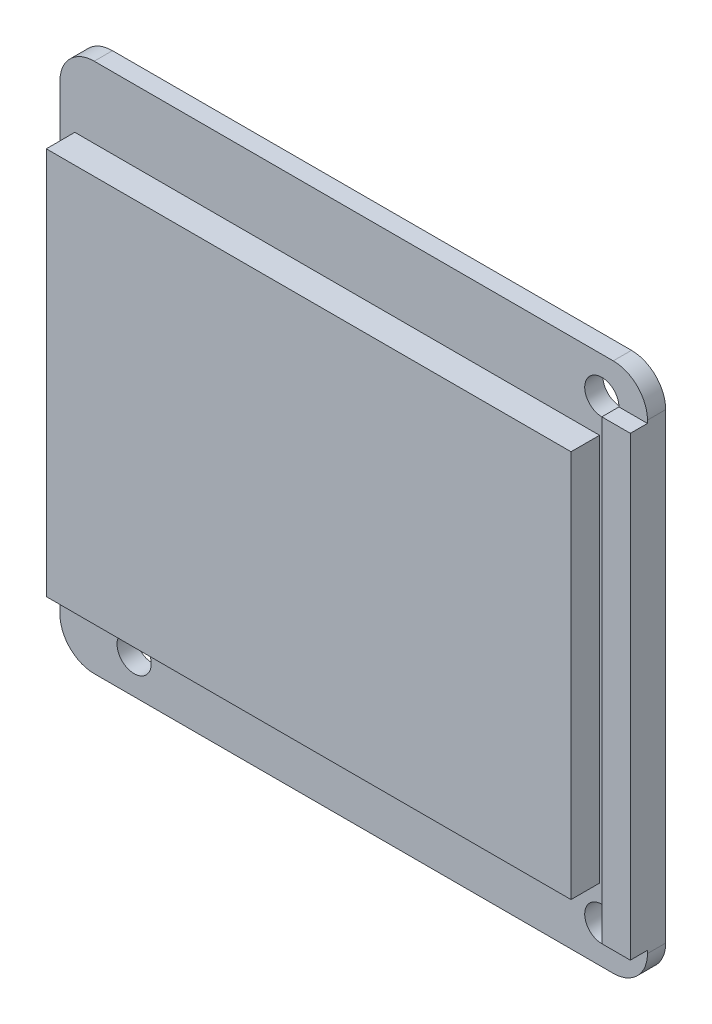
ISO-10303-21;
HEADER;
FILE_DESCRIPTION(('STEP AP214'),'2;1');
FILE_NAME('part.step','',(''),(''),'','','');
FILE_SCHEMA(('AUTOMOTIVE_DESIGN { 1 0 10303 214 1 1 1 1 }'));
ENDSEC;
DATA;
#1=APPLICATION_CONTEXT('core data for automotive mechanical design processes');
#2=APPLICATION_PROTOCOL_DEFINITION('international standard','automotive_design',2000,#1);
#3=PRODUCT_CONTEXT('',#1,'mechanical');
#4=PRODUCT('Part','Part','',(#3));
#5=PRODUCT_RELATED_PRODUCT_CATEGORY('part','',(#4));
#6=PRODUCT_DEFINITION_FORMATION('','',#4);
#7=PRODUCT_DEFINITION_CONTEXT('part definition',#1,'design');
#8=PRODUCT_DEFINITION('design','',#6,#7);
#9=PRODUCT_DEFINITION_SHAPE('','',#8);
#10=(LENGTH_UNIT() NAMED_UNIT(*) SI_UNIT(.MILLI.,.METRE.));
#11=(NAMED_UNIT(*) PLANE_ANGLE_UNIT() SI_UNIT($,.RADIAN.));
#12=(NAMED_UNIT(*) SI_UNIT($,.STERADIAN.) SOLID_ANGLE_UNIT());
#13=UNCERTAINTY_MEASURE_WITH_UNIT(LENGTH_MEASURE(1.E-05),#10,'distance_accuracy_value','');
#14=(GEOMETRIC_REPRESENTATION_CONTEXT(3) GLOBAL_UNCERTAINTY_ASSIGNED_CONTEXT((#13)) GLOBAL_UNIT_ASSIGNED_CONTEXT((#10,
#11,#12)) REPRESENTATION_CONTEXT('',''));
#15=CARTESIAN_POINT('',(0.,0.,0.));
#16=DIRECTION('',(0.,0.,1.));
#17=DIRECTION('',(1.,0.,0.));
#18=AXIS2_PLACEMENT_3D('',#15,#16,#17);
#19=CARTESIAN_POINT('',(0.,0.,1.6));
#20=DIRECTION('',(0.,0.,-1.));
#21=DIRECTION('',(-1.,0.,0.));
#22=AXIS2_PLACEMENT_3D('',#19,#20,#21);
#23=PLANE('',#22);
#24=CARTESIAN_POINT('',(6.5,3.25,1.6));
#25=DIRECTION('',(0.,0.,1.));
#26=DIRECTION('',(1.,0.,0.));
#27=AXIS2_PLACEMENT_3D('',#24,#25,#26);
#28=CIRCLE('',#27,1.5);
#29=CARTESIAN_POINT('',(8.,3.25,1.6));
#30=VERTEX_POINT('',#29);
#31=EDGE_CURVE('E504',#30,#30,#28,.T.);
#32=ORIENTED_EDGE('',*,*,#31,.F.);
#33=EDGE_LOOP('',(#32));
#34=FACE_BOUND('',#33,.T.);
#35=DIRECTION('',(0.,-1.,0.));
#36=VECTOR('',#35,1.);
#37=CARTESIAN_POINT('',(1.3,40.25,1.6));
#38=LINE('',#37,#36);
#39=CARTESIAN_POINT('',(1.3,40.25,1.6));
#40=VERTEX_POINT('',#39);
#41=CARTESIAN_POINT('',(1.3,6.25,1.6));
#42=VERTEX_POINT('',#41);
#43=EDGE_CURVE('E174',#40,#42,#38,.T.);
#44=ORIENTED_EDGE('',*,*,#43,.F.);
#45=DIRECTION('',(-1.,0.,0.));
#46=VECTOR('',#45,1.);
#47=CARTESIAN_POINT('',(1.3,40.25,1.6));
#48=LINE('',#47,#46);
#49=CARTESIAN_POINT('',(47.3,40.25,1.6));
#50=VERTEX_POINT('',#49);
#51=EDGE_CURVE('E187',#50,#40,#48,.T.);
#52=ORIENTED_EDGE('',*,*,#51,.F.);
#53=DIRECTION('',(0.,1.,0.));
#54=VECTOR('',#53,1.);
#55=CARTESIAN_POINT('',(47.3,40.25,1.6));
#56=LINE('',#55,#54);
#57=CARTESIAN_POINT('',(47.3,6.25,1.6));
#58=VERTEX_POINT('',#57);
#59=EDGE_CURVE('E196',#58,#50,#56,.T.);
#60=ORIENTED_EDGE('',*,*,#59,.F.);
#61=DIRECTION('',(1.,0.,0.));
#62=VECTOR('',#61,1.);
#63=CARTESIAN_POINT('',(1.3,6.25,1.6));
#64=LINE('',#63,#62);
#65=EDGE_CURVE('E177',#42,#58,#64,.T.);
#66=ORIENTED_EDGE('',*,*,#65,.F.);
#67=EDGE_LOOP('',(#44,#52,#60,#66));
#68=FACE_BOUND('',#67,.T.);
#69=DIRECTION('',(0.,1.,0.));
#70=VECTOR('',#69,1.);
#71=CARTESIAN_POINT('',(51.5,0.,1.6));
#72=LINE('',#71,#70);
#73=CARTESIAN_POINT('',(51.5,43.25,1.6));
#74=VERTEX_POINT('',#73);
#75=CARTESIAN_POINT('',(51.5,43.5,1.6));
#76=VERTEX_POINT('',#75);
#77=EDGE_CURVE('E172',#74,#76,#72,.T.);
#78=ORIENTED_EDGE('',*,*,#77,.T.);
#79=CARTESIAN_POINT('',(48.5,43.5,1.6));
#80=DIRECTION('',(0.,0.,-1.));
#81=DIRECTION('',(-1.,0.,0.));
#82=AXIS2_PLACEMENT_3D('',#79,#80,#81);
#83=CIRCLE('',#82,3.);
#84=CARTESIAN_POINT('',(48.5,46.5,1.6));
#85=VERTEX_POINT('',#84);
#86=EDGE_CURVE('E254',#76,#85,#83,.F.);
#87=ORIENTED_EDGE('',*,*,#86,.T.);
#88=DIRECTION('',(-1.,0.,0.));
#89=VECTOR('',#88,1.);
#90=CARTESIAN_POINT('',(0.,46.5,1.6));
#91=LINE('',#90,#89);
#92=CARTESIAN_POINT('',(3.,46.5,1.6));
#93=VERTEX_POINT('',#92);
#94=EDGE_CURVE('E220',#85,#93,#91,.T.);
#95=ORIENTED_EDGE('',*,*,#94,.T.);
#96=CARTESIAN_POINT('',(3.,43.5,1.6));
#97=DIRECTION('',(0.,0.,-1.));
#98=DIRECTION('',(-1.,0.,0.));
#99=AXIS2_PLACEMENT_3D('',#96,#97,#98);
#100=CIRCLE('',#99,3.);
#101=CARTESIAN_POINT('',(0.,43.5,1.6));
#102=VERTEX_POINT('',#101);
#103=EDGE_CURVE('E252',#93,#102,#100,.F.);
#104=ORIENTED_EDGE('',*,*,#103,.T.);
#105=DIRECTION('',(0.,-1.,0.));
#106=VECTOR('',#105,1.);
#107=CARTESIAN_POINT('',(0.,0.,1.6));
#108=LINE('',#107,#106);
#109=CARTESIAN_POINT('',(0.,3.,1.6));
#110=VERTEX_POINT('',#109);
#111=EDGE_CURVE('E213',#102,#110,#108,.T.);
#112=ORIENTED_EDGE('',*,*,#111,.T.);
#113=CARTESIAN_POINT('',(3.,3.,1.6));
#114=DIRECTION('',(0.,0.,-1.));
#115=DIRECTION('',(-1.,0.,0.));
#116=AXIS2_PLACEMENT_3D('',#113,#114,#115);
#117=CIRCLE('',#116,3.);
#118=CARTESIAN_POINT('',(3.,0.,1.6));
#119=VERTEX_POINT('',#118);
#120=EDGE_CURVE('E54',#110,#119,#117,.F.);
#121=ORIENTED_EDGE('',*,*,#120,.T.);
#122=DIRECTION('',(1.,0.,0.));
#123=VECTOR('',#122,1.);
#124=CARTESIAN_POINT('',(0.,0.,1.6));
#125=LINE('',#124,#123);
#126=CARTESIAN_POINT('',(48.5,0.,1.6));
#127=VERTEX_POINT('',#126);
#128=EDGE_CURVE('E215',#119,#127,#125,.T.);
#129=ORIENTED_EDGE('',*,*,#128,.T.);
#130=CARTESIAN_POINT('',(48.5,3.,1.6));
#131=DIRECTION('',(0.,0.,-1.));
#132=DIRECTION('',(-1.,0.,0.));
#133=AXIS2_PLACEMENT_3D('',#130,#131,#132);
#134=CIRCLE('',#133,3.);
#135=CARTESIAN_POINT('',(51.5,3.,1.6));
#136=VERTEX_POINT('',#135);
#137=EDGE_CURVE('E249',#127,#136,#134,.F.);
#138=ORIENTED_EDGE('',*,*,#137,.T.);
#139=CARTESIAN_POINT('',(51.5,3.25,1.6));
#140=VERTEX_POINT('',#139);
#141=EDGE_CURVE('E218',#136,#140,#72,.T.);
#142=ORIENTED_EDGE('',*,*,#141,.T.);
#143=DIRECTION('',(1.,0.,0.));
#144=VECTOR('',#143,1.);
#145=CARTESIAN_POINT('',(51.5,3.25,1.6));
#146=LINE('',#145,#144);
#147=CARTESIAN_POINT('',(49.,3.25,1.6));
#148=VERTEX_POINT('',#147);
#149=EDGE_CURVE('E167',#148,#140,#146,.T.);
#150=ORIENTED_EDGE('',*,*,#149,.F.);
#151=CARTESIAN_POINT('',(47.5,3.25,1.6));
#152=DIRECTION('',(0.,0.,1.));
#153=DIRECTION('',(1.,0.,0.));
#154=AXIS2_PLACEMENT_3D('',#151,#152,#153);
#155=CIRCLE('',#154,1.5);
#156=EDGE_CURVE('E501',#148,#148,#155,.T.);
#157=ORIENTED_EDGE('',*,*,#156,.F.);
#158=DIRECTION('',(0.,-1.,0.));
#159=VECTOR('',#158,1.);
#160=CARTESIAN_POINT('',(49.,43.25,1.6));
#161=LINE('',#160,#159);
#162=CARTESIAN_POINT('',(49.,43.25,1.6));
#163=VERTEX_POINT('',#162);
#164=EDGE_CURVE('E518',#163,#148,#161,.T.);
#165=ORIENTED_EDGE('',*,*,#164,.F.);
#166=CARTESIAN_POINT('',(47.5,43.25,1.6));
#167=DIRECTION('',(0.,0.,1.));
#168=DIRECTION('',(1.,0.,0.));
#169=AXIS2_PLACEMENT_3D('',#166,#167,#168);
#170=CIRCLE('',#169,1.5);
#171=EDGE_CURVE('E497',#163,#163,#170,.T.);
#172=ORIENTED_EDGE('',*,*,#171,.F.);
#173=DIRECTION('',(-1.,0.,0.));
#174=VECTOR('',#173,1.);
#175=CARTESIAN_POINT('',(51.5,43.25,1.6));
#176=LINE('',#175,#174);
#177=EDGE_CURVE('E512',#74,#163,#176,.T.);
#178=ORIENTED_EDGE('',*,*,#177,.F.);
#179=EDGE_LOOP('',(#78,#87,#95,#104,#112,#121,#129,#138,#142,#150,#157,#165,#172,#178));
#180=FACE_BOUND('',#179,.T.);
#181=ADVANCED_FACE('F33',(#34,#68,#180),#23,.F.);
#182=CARTESIAN_POINT('',(0.,0.,1.6));
#183=DIRECTION('',(1.,0.,0.));
#184=DIRECTION('',(0.,0.,-1.));
#185=AXIS2_PLACEMENT_3D('',#182,#183,#184);
#186=PLANE('',#185);
#187=ORIENTED_EDGE('',*,*,#111,.F.);
#188=DIRECTION('',(0.,0.,-1.));
#189=VECTOR('',#188,1.);
#190=CARTESIAN_POINT('',(0.,43.5,1.6));
#191=LINE('',#190,#189);
#192=CARTESIAN_POINT('',(0.,43.5,0.));
#193=VERTEX_POINT('',#192);
#194=EDGE_CURVE('E258',#102,#193,#191,.T.);
#195=ORIENTED_EDGE('',*,*,#194,.T.);
#196=DIRECTION('',(0.,-1.,0.));
#197=VECTOR('',#196,1.);
#198=CARTESIAN_POINT('',(0.,0.,0.));
#199=LINE('',#198,#197);
#200=CARTESIAN_POINT('',(0.,3.,0.));
#201=VERTEX_POINT('',#200);
#202=EDGE_CURVE('E212',#193,#201,#199,.T.);
#203=ORIENTED_EDGE('',*,*,#202,.T.);
#204=DIRECTION('',(0.,0.,-1.));
#205=VECTOR('',#204,1.);
#206=CARTESIAN_POINT('',(0.,3.,1.6));
#207=LINE('',#206,#205);
#208=EDGE_CURVE('E256',#201,#110,#207,.F.);
#209=ORIENTED_EDGE('',*,*,#208,.T.);
#210=EDGE_LOOP('',(#187,#195,#203,#209));
#211=FACE_BOUND('',#210,.T.);
#212=ADVANCED_FACE('F264',(#211),#186,.F.);
#213=CARTESIAN_POINT('',(0.,0.,1.6));
#214=DIRECTION('',(0.,1.,0.));
#215=DIRECTION('',(0.,0.,1.));
#216=AXIS2_PLACEMENT_3D('',#213,#214,#215);
#217=PLANE('',#216);
#218=ORIENTED_EDGE('',*,*,#128,.F.);
#219=DIRECTION('',(0.,0.,-1.));
#220=VECTOR('',#219,1.);
#221=CARTESIAN_POINT('',(3.,0.,1.6));
#222=LINE('',#221,#220);
#223=CARTESIAN_POINT('',(3.,0.,0.));
#224=VERTEX_POINT('',#223);
#225=EDGE_CURVE('E11',#119,#224,#222,.T.);
#226=ORIENTED_EDGE('',*,*,#225,.T.);
#227=DIRECTION('',(1.,0.,0.));
#228=VECTOR('',#227,1.);
#229=CARTESIAN_POINT('',(0.,0.,0.));
#230=LINE('',#229,#228);
#231=CARTESIAN_POINT('',(48.5,0.,0.));
#232=VERTEX_POINT('',#231);
#233=EDGE_CURVE('E226',#224,#232,#230,.T.);
#234=ORIENTED_EDGE('',*,*,#233,.T.);
#235=DIRECTION('',(0.,0.,-1.));
#236=VECTOR('',#235,1.);
#237=CARTESIAN_POINT('',(48.5,0.,1.6));
#238=LINE('',#237,#236);
#239=EDGE_CURVE('E41',#232,#127,#238,.F.);
#240=ORIENTED_EDGE('',*,*,#239,.T.);
#241=EDGE_LOOP('',(#218,#226,#234,#240));
#242=FACE_BOUND('',#241,.T.);
#243=ADVANCED_FACE('F275',(#242),#217,.F.);
#244=CARTESIAN_POINT('',(51.5,0.,1.6));
#245=DIRECTION('',(-1.,0.,0.));
#246=DIRECTION('',(0.,0.,1.));
#247=AXIS2_PLACEMENT_3D('',#244,#245,#246);
#248=PLANE('',#247);
#249=DIRECTION('',(0.,1.,0.));
#250=VECTOR('',#249,1.);
#251=CARTESIAN_POINT('',(51.5,0.,0.));
#252=LINE('',#251,#250);
#253=CARTESIAN_POINT('',(51.5,3.,0.));
#254=VERTEX_POINT('',#253);
#255=CARTESIAN_POINT('',(51.5,43.5,0.));
#256=VERTEX_POINT('',#255);
#257=EDGE_CURVE('E228',#254,#256,#252,.T.);
#258=ORIENTED_EDGE('',*,*,#257,.T.);
#259=DIRECTION('',(0.,0.,-1.));
#260=VECTOR('',#259,1.);
#261=CARTESIAN_POINT('',(51.5,43.5,1.6));
#262=LINE('',#261,#260);
#263=EDGE_CURVE('E247',#256,#76,#262,.F.);
#264=ORIENTED_EDGE('',*,*,#263,.T.);
#265=ORIENTED_EDGE('',*,*,#77,.F.);
#266=DIRECTION('',(0.,0.,-1.));
#267=VECTOR('',#266,1.);
#268=CARTESIAN_POINT('',(51.5,43.25,3.1));
#269=LINE('',#268,#267);
#270=CARTESIAN_POINT('',(51.5,43.25,3.1));
#271=VERTEX_POINT('',#270);
#272=EDGE_CURVE('E152',#271,#74,#269,.T.);
#273=ORIENTED_EDGE('',*,*,#272,.F.);
#274=DIRECTION('',(0.,1.,0.));
#275=VECTOR('',#274,1.);
#276=CARTESIAN_POINT('',(51.5,43.25,3.1));
#277=LINE('',#276,#275);
#278=CARTESIAN_POINT('',(51.5,3.25,3.1));
#279=VERTEX_POINT('',#278);
#280=EDGE_CURVE('E158',#279,#271,#277,.T.);
#281=ORIENTED_EDGE('',*,*,#280,.F.);
#282=DIRECTION('',(0.,0.,-1.));
#283=VECTOR('',#282,1.);
#284=CARTESIAN_POINT('',(51.5,3.25,3.1));
#285=LINE('',#284,#283);
#286=EDGE_CURVE('E516',#279,#140,#285,.T.);
#287=ORIENTED_EDGE('',*,*,#286,.T.);
#288=ORIENTED_EDGE('',*,*,#141,.F.);
#289=DIRECTION('',(0.,0.,-1.));
#290=VECTOR('',#289,1.);
#291=CARTESIAN_POINT('',(51.5,3.,1.6));
#292=LINE('',#291,#290);
#293=EDGE_CURVE('E244',#136,#254,#292,.T.);
#294=ORIENTED_EDGE('',*,*,#293,.T.);
#295=EDGE_LOOP('',(#258,#264,#265,#273,#281,#287,#288,#294));
#296=FACE_BOUND('',#295,.T.);
#297=ADVANCED_FACE('F170',(#296),#248,.F.);
#298=CARTESIAN_POINT('',(0.,46.5,1.6));
#299=DIRECTION('',(0.,-1.,0.));
#300=DIRECTION('',(0.,0.,-1.));
#301=AXIS2_PLACEMENT_3D('',#298,#299,#300);
#302=PLANE('',#301);
#303=ORIENTED_EDGE('',*,*,#94,.F.);
#304=DIRECTION('',(0.,0.,-1.));
#305=VECTOR('',#304,1.);
#306=CARTESIAN_POINT('',(48.5,46.5,1.6));
#307=LINE('',#306,#305);
#308=CARTESIAN_POINT('',(48.5,46.5,0.));
#309=VERTEX_POINT('',#308);
#310=EDGE_CURVE('E233',#85,#309,#307,.T.);
#311=ORIENTED_EDGE('',*,*,#310,.T.);
#312=DIRECTION('',(-1.,0.,0.));
#313=VECTOR('',#312,1.);
#314=CARTESIAN_POINT('',(0.,46.5,0.));
#315=LINE('',#314,#313);
#316=CARTESIAN_POINT('',(3.,46.5,0.));
#317=VERTEX_POINT('',#316);
#318=EDGE_CURVE('E216',#309,#317,#315,.T.);
#319=ORIENTED_EDGE('',*,*,#318,.T.);
#320=DIRECTION('',(0.,0.,-1.));
#321=VECTOR('',#320,1.);
#322=CARTESIAN_POINT('',(3.,46.5,1.6));
#323=LINE('',#322,#321);
#324=EDGE_CURVE('E223',#317,#93,#323,.F.);
#325=ORIENTED_EDGE('',*,*,#324,.T.);
#326=EDGE_LOOP('',(#303,#311,#319,#325));
#327=FACE_BOUND('',#326,.T.);
#328=ADVANCED_FACE('F288',(#327),#302,.F.);
#329=CARTESIAN_POINT('',(0.,0.,0.));
#330=DIRECTION('',(0.,0.,-1.));
#331=DIRECTION('',(-1.,0.,0.));
#332=AXIS2_PLACEMENT_3D('',#329,#330,#331);
#333=PLANE('',#332);
#334=CARTESIAN_POINT('',(47.5,43.25,0.));
#335=DIRECTION('',(0.,0.,1.));
#336=DIRECTION('',(1.,0.,0.));
#337=AXIS2_PLACEMENT_3D('',#334,#335,#336);
#338=CIRCLE('',#337,1.5);
#339=CARTESIAN_POINT('',(49.,43.25,0.));
#340=VERTEX_POINT('',#339);
#341=EDGE_CURVE('E495',#340,#340,#338,.T.);
#342=ORIENTED_EDGE('',*,*,#341,.T.);
#343=EDGE_LOOP('',(#342));
#344=FACE_BOUND('',#343,.T.);
#345=CARTESIAN_POINT('',(6.5,3.25,0.));
#346=DIRECTION('',(0.,0.,1.));
#347=DIRECTION('',(1.,0.,0.));
#348=AXIS2_PLACEMENT_3D('',#345,#346,#347);
#349=CIRCLE('',#348,1.5);
#350=CARTESIAN_POINT('',(8.,3.25,0.));
#351=VERTEX_POINT('',#350);
#352=EDGE_CURVE('E499',#351,#351,#349,.T.);
#353=ORIENTED_EDGE('',*,*,#352,.T.);
#354=EDGE_LOOP('',(#353));
#355=FACE_BOUND('',#354,.T.);
#356=CARTESIAN_POINT('',(47.5,3.25,0.));
#357=DIRECTION('',(0.,0.,1.));
#358=DIRECTION('',(1.,0.,0.));
#359=AXIS2_PLACEMENT_3D('',#356,#357,#358);
#360=CIRCLE('',#359,1.5);
#361=CARTESIAN_POINT('',(49.,3.25,0.));
#362=VERTEX_POINT('',#361);
#363=EDGE_CURVE('E509',#362,#362,#360,.T.);
#364=ORIENTED_EDGE('',*,*,#363,.T.);
#365=EDGE_LOOP('',(#364));
#366=FACE_BOUND('',#365,.T.);
#367=ORIENTED_EDGE('',*,*,#318,.F.);
#368=CARTESIAN_POINT('',(48.5,43.5,0.));
#369=DIRECTION('',(0.,0.,-1.));
#370=DIRECTION('',(-1.,0.,0.));
#371=AXIS2_PLACEMENT_3D('',#368,#369,#370);
#372=CIRCLE('',#371,3.);
#373=EDGE_CURVE('E242',#309,#256,#372,.T.);
#374=ORIENTED_EDGE('',*,*,#373,.T.);
#375=ORIENTED_EDGE('',*,*,#257,.F.);
#376=CARTESIAN_POINT('',(48.5,3.,0.));
#377=DIRECTION('',(0.,0.,-1.));
#378=DIRECTION('',(-1.,0.,0.));
#379=AXIS2_PLACEMENT_3D('',#376,#377,#378);
#380=CIRCLE('',#379,3.);
#381=EDGE_CURVE('E236',#254,#232,#380,.T.);
#382=ORIENTED_EDGE('',*,*,#381,.T.);
#383=ORIENTED_EDGE('',*,*,#233,.F.);
#384=CARTESIAN_POINT('',(3.,3.,0.));
#385=DIRECTION('',(0.,0.,-1.));
#386=DIRECTION('',(-1.,0.,0.));
#387=AXIS2_PLACEMENT_3D('',#384,#385,#386);
#388=CIRCLE('',#387,3.);
#389=EDGE_CURVE('E238',#224,#201,#388,.T.);
#390=ORIENTED_EDGE('',*,*,#389,.T.);
#391=ORIENTED_EDGE('',*,*,#202,.F.);
#392=CARTESIAN_POINT('',(3.,43.5,0.));
#393=DIRECTION('',(0.,0.,-1.));
#394=DIRECTION('',(-1.,0.,0.));
#395=AXIS2_PLACEMENT_3D('',#392,#393,#394);
#396=CIRCLE('',#395,3.);
#397=EDGE_CURVE('E240',#193,#317,#396,.T.);
#398=ORIENTED_EDGE('',*,*,#397,.T.);
#399=EDGE_LOOP('',(#367,#374,#375,#382,#383,#390,#391,#398));
#400=FACE_BOUND('',#399,.T.);
#401=ADVANCED_FACE('F270',(#344,#355,#366,#400),#333,.T.);
#402=CARTESIAN_POINT('',(1.3,40.25,4.1));
#403=DIRECTION('',(1.,0.,0.));
#404=DIRECTION('',(0.,0.,-1.));
#405=AXIS2_PLACEMENT_3D('',#402,#403,#404);
#406=PLANE('',#405);
#407=ORIENTED_EDGE('',*,*,#43,.T.);
#408=DIRECTION('',(0.,0.,-1.));
#409=VECTOR('',#408,1.);
#410=CARTESIAN_POINT('',(1.3,6.25,4.1));
#411=LINE('',#410,#409);
#412=CARTESIAN_POINT('',(1.3,6.25,4.1));
#413=VERTEX_POINT('',#412);
#414=EDGE_CURVE('E209',#413,#42,#411,.T.);
#415=ORIENTED_EDGE('',*,*,#414,.F.);
#416=DIRECTION('',(0.,-1.,0.));
#417=VECTOR('',#416,1.);
#418=CARTESIAN_POINT('',(1.3,40.25,4.1));
#419=LINE('',#418,#417);
#420=CARTESIAN_POINT('',(1.3,40.25,4.1));
#421=VERTEX_POINT('',#420);
#422=EDGE_CURVE('E183',#421,#413,#419,.T.);
#423=ORIENTED_EDGE('',*,*,#422,.F.);
#424=DIRECTION('',(0.,0.,-1.));
#425=VECTOR('',#424,1.);
#426=CARTESIAN_POINT('',(1.3,40.25,4.1));
#427=LINE('',#426,#425);
#428=EDGE_CURVE('E192',#421,#40,#427,.T.);
#429=ORIENTED_EDGE('',*,*,#428,.T.);
#430=EDGE_LOOP('',(#407,#415,#423,#429));
#431=FACE_BOUND('',#430,.T.);
#432=ADVANCED_FACE('F310',(#431),#406,.F.);
#433=CARTESIAN_POINT('',(1.3,6.25,4.1));
#434=DIRECTION('',(0.,1.,0.));
#435=DIRECTION('',(0.,0.,1.));
#436=AXIS2_PLACEMENT_3D('',#433,#434,#435);
#437=PLANE('',#436);
#438=ORIENTED_EDGE('',*,*,#65,.T.);
#439=DIRECTION('',(0.,0.,-1.));
#440=VECTOR('',#439,1.);
#441=CARTESIAN_POINT('',(47.3,6.25,4.1));
#442=LINE('',#441,#440);
#443=CARTESIAN_POINT('',(47.3,6.25,4.1));
#444=VERTEX_POINT('',#443);
#445=EDGE_CURVE('E206',#444,#58,#442,.T.);
#446=ORIENTED_EDGE('',*,*,#445,.F.);
#447=DIRECTION('',(1.,0.,0.));
#448=VECTOR('',#447,1.);
#449=CARTESIAN_POINT('',(1.3,6.25,4.1));
#450=LINE('',#449,#448);
#451=EDGE_CURVE('E186',#413,#444,#450,.T.);
#452=ORIENTED_EDGE('',*,*,#451,.F.);
#453=ORIENTED_EDGE('',*,*,#414,.T.);
#454=EDGE_LOOP('',(#438,#446,#452,#453));
#455=FACE_BOUND('',#454,.T.);
#456=ADVANCED_FACE('F343',(#455),#437,.F.);
#457=CARTESIAN_POINT('',(47.3,40.25,4.1));
#458=DIRECTION('',(-1.,0.,0.));
#459=DIRECTION('',(0.,0.,1.));
#460=AXIS2_PLACEMENT_3D('',#457,#458,#459);
#461=PLANE('',#460);
#462=ORIENTED_EDGE('',*,*,#59,.T.);
#463=DIRECTION('',(0.,0.,-1.));
#464=VECTOR('',#463,1.);
#465=CARTESIAN_POINT('',(47.3,40.25,4.1));
#466=LINE('',#465,#464);
#467=CARTESIAN_POINT('',(47.3,40.25,4.1));
#468=VERTEX_POINT('',#467);
#469=EDGE_CURVE('E203',#468,#50,#466,.T.);
#470=ORIENTED_EDGE('',*,*,#469,.F.);
#471=DIRECTION('',(0.,1.,0.));
#472=VECTOR('',#471,1.);
#473=CARTESIAN_POINT('',(47.3,40.25,4.1));
#474=LINE('',#473,#472);
#475=EDGE_CURVE('E189',#444,#468,#474,.T.);
#476=ORIENTED_EDGE('',*,*,#475,.F.);
#477=ORIENTED_EDGE('',*,*,#445,.T.);
#478=EDGE_LOOP('',(#462,#470,#476,#477));
#479=FACE_BOUND('',#478,.T.);
#480=ADVANCED_FACE('F350',(#479),#461,.F.);
#481=CARTESIAN_POINT('',(1.3,40.25,4.1));
#482=DIRECTION('',(0.,-1.,0.));
#483=DIRECTION('',(0.,0.,-1.));
#484=AXIS2_PLACEMENT_3D('',#481,#482,#483);
#485=PLANE('',#484);
#486=ORIENTED_EDGE('',*,*,#51,.T.);
#487=ORIENTED_EDGE('',*,*,#428,.F.);
#488=DIRECTION('',(-1.,0.,0.));
#489=VECTOR('',#488,1.);
#490=CARTESIAN_POINT('',(1.3,40.25,4.1));
#491=LINE('',#490,#489);
#492=EDGE_CURVE('E191',#468,#421,#491,.T.);
#493=ORIENTED_EDGE('',*,*,#492,.F.);
#494=ORIENTED_EDGE('',*,*,#469,.T.);
#495=EDGE_LOOP('',(#486,#487,#493,#494));
#496=FACE_BOUND('',#495,.T.);
#497=ADVANCED_FACE('F357',(#496),#485,.F.);
#498=CARTESIAN_POINT('',(0.,0.,4.1));
#499=DIRECTION('',(0.,0.,1.));
#500=DIRECTION('',(1.,0.,0.));
#501=AXIS2_PLACEMENT_3D('',#498,#499,#500);
#502=PLANE('',#501);
#503=ORIENTED_EDGE('',*,*,#422,.T.);
#504=ORIENTED_EDGE('',*,*,#451,.T.);
#505=ORIENTED_EDGE('',*,*,#475,.T.);
#506=ORIENTED_EDGE('',*,*,#492,.T.);
#507=EDGE_LOOP('',(#503,#504,#505,#506));
#508=FACE_BOUND('',#507,.T.);
#509=ADVANCED_FACE('F365',(#508),#502,.T.);
#510=CARTESIAN_POINT('',(51.5,43.25,3.1));
#511=DIRECTION('',(0.,-1.,0.));
#512=DIRECTION('',(0.,0.,-1.));
#513=AXIS2_PLACEMENT_3D('',#510,#511,#512);
#514=PLANE('',#513);
#515=ORIENTED_EDGE('',*,*,#177,.T.);
#516=DIRECTION('',(0.,0.,-1.));
#517=VECTOR('',#516,1.);
#518=CARTESIAN_POINT('',(49.,43.25,3.1));
#519=LINE('',#518,#517);
#520=CARTESIAN_POINT('',(49.,43.25,3.1));
#521=VERTEX_POINT('',#520);
#522=EDGE_CURVE('E154',#521,#163,#519,.T.);
#523=ORIENTED_EDGE('',*,*,#522,.F.);
#524=DIRECTION('',(-1.,0.,0.));
#525=VECTOR('',#524,1.);
#526=CARTESIAN_POINT('',(51.5,43.25,3.1));
#527=LINE('',#526,#525);
#528=EDGE_CURVE('E147',#271,#521,#527,.T.);
#529=ORIENTED_EDGE('',*,*,#528,.F.);
#530=ORIENTED_EDGE('',*,*,#272,.T.);
#531=EDGE_LOOP('',(#515,#523,#529,#530));
#532=FACE_BOUND('',#531,.T.);
#533=ADVANCED_FACE('F150',(#532),#514,.F.);
#534=CARTESIAN_POINT('',(49.,43.25,3.1));
#535=DIRECTION('',(1.,0.,0.));
#536=DIRECTION('',(0.,0.,-1.));
#537=AXIS2_PLACEMENT_3D('',#534,#535,#536);
#538=PLANE('',#537);
#539=ORIENTED_EDGE('',*,*,#164,.T.);
#540=DIRECTION('',(0.,0.,-1.));
#541=VECTOR('',#540,1.);
#542=CARTESIAN_POINT('',(49.,3.25,3.1));
#543=LINE('',#542,#541);
#544=CARTESIAN_POINT('',(49.,3.25,3.1));
#545=VERTEX_POINT('',#544);
#546=EDGE_CURVE('E179',#545,#148,#543,.T.);
#547=ORIENTED_EDGE('',*,*,#546,.F.);
#548=DIRECTION('',(0.,-1.,0.));
#549=VECTOR('',#548,1.);
#550=CARTESIAN_POINT('',(49.,43.25,3.1));
#551=LINE('',#550,#549);
#552=EDGE_CURVE('E157',#521,#545,#551,.T.);
#553=ORIENTED_EDGE('',*,*,#552,.F.);
#554=ORIENTED_EDGE('',*,*,#522,.T.);
#555=EDGE_LOOP('',(#539,#547,#553,#554));
#556=FACE_BOUND('',#555,.T.);
#557=ADVANCED_FACE('F381',(#556),#538,.F.);
#558=CARTESIAN_POINT('',(51.5,3.25,3.1));
#559=DIRECTION('',(0.,1.,0.));
#560=DIRECTION('',(0.,0.,1.));
#561=AXIS2_PLACEMENT_3D('',#558,#559,#560);
#562=PLANE('',#561);
#563=ORIENTED_EDGE('',*,*,#149,.T.);
#564=ORIENTED_EDGE('',*,*,#286,.F.);
#565=DIRECTION('',(1.,0.,0.));
#566=VECTOR('',#565,1.);
#567=CARTESIAN_POINT('',(51.5,3.25,3.1));
#568=LINE('',#567,#566);
#569=EDGE_CURVE('E163',#545,#279,#568,.T.);
#570=ORIENTED_EDGE('',*,*,#569,.F.);
#571=ORIENTED_EDGE('',*,*,#546,.T.);
#572=EDGE_LOOP('',(#563,#564,#570,#571));
#573=FACE_BOUND('',#572,.T.);
#574=ADVANCED_FACE('F388',(#573),#562,.F.);
#575=CARTESIAN_POINT('',(0.,0.,3.1));
#576=DIRECTION('',(0.,0.,-1.));
#577=DIRECTION('',(-1.,0.,0.));
#578=AXIS2_PLACEMENT_3D('',#575,#576,#577);
#579=PLANE('',#578);
#580=ORIENTED_EDGE('',*,*,#280,.T.);
#581=ORIENTED_EDGE('',*,*,#528,.T.);
#582=ORIENTED_EDGE('',*,*,#552,.T.);
#583=ORIENTED_EDGE('',*,*,#569,.T.);
#584=EDGE_LOOP('',(#580,#581,#582,#583));
#585=FACE_BOUND('',#584,.T.);
#586=ADVANCED_FACE('F161',(#585),#579,.F.);
#587=CARTESIAN_POINT('',(47.5,3.25,0.));
#588=DIRECTION('',(0.,0.,1.));
#589=DIRECTION('',(1.,0.,0.));
#590=AXIS2_PLACEMENT_3D('',#587,#588,#589);
#591=CYLINDRICAL_SURFACE('',#590,1.5);
#592=ORIENTED_EDGE('',*,*,#363,.F.);
#593=EDGE_LOOP('',(#592));
#594=FACE_BOUND('',#593,.T.);
#595=ORIENTED_EDGE('',*,*,#156,.T.);
#596=EDGE_LOOP('',(#595));
#597=FACE_BOUND('',#596,.T.);
#598=ADVANCED_FACE('F403',(#594,#597),#591,.F.);
#599=CARTESIAN_POINT('',(6.5,3.25,0.));
#600=DIRECTION('',(0.,0.,1.));
#601=DIRECTION('',(1.,0.,0.));
#602=AXIS2_PLACEMENT_3D('',#599,#600,#601);
#603=CYLINDRICAL_SURFACE('',#602,1.5);
#604=ORIENTED_EDGE('',*,*,#352,.F.);
#605=EDGE_LOOP('',(#604));
#606=FACE_BOUND('',#605,.T.);
#607=ORIENTED_EDGE('',*,*,#31,.T.);
#608=EDGE_LOOP('',(#607));
#609=FACE_BOUND('',#608,.T.);
#610=ADVANCED_FACE('F409',(#606,#609),#603,.F.);
#611=CARTESIAN_POINT('',(47.5,43.25,0.));
#612=DIRECTION('',(0.,0.,1.));
#613=DIRECTION('',(1.,0.,0.));
#614=AXIS2_PLACEMENT_3D('',#611,#612,#613);
#615=CYLINDRICAL_SURFACE('',#614,1.5);
#616=ORIENTED_EDGE('',*,*,#341,.F.);
#617=EDGE_LOOP('',(#616));
#618=FACE_BOUND('',#617,.T.);
#619=ORIENTED_EDGE('',*,*,#171,.T.);
#620=EDGE_LOOP('',(#619));
#621=FACE_BOUND('',#620,.T.);
#622=ADVANCED_FACE('F297',(#618,#621),#615,.F.);
#623=CARTESIAN_POINT('',(48.5,43.5,1.6));
#624=DIRECTION('',(0.,0.,-1.));
#625=DIRECTION('',(-1.,0.,0.));
#626=AXIS2_PLACEMENT_3D('',#623,#624,#625);
#627=CYLINDRICAL_SURFACE('',#626,3.);
#628=ORIENTED_EDGE('',*,*,#86,.F.);
#629=ORIENTED_EDGE('',*,*,#263,.F.);
#630=ORIENTED_EDGE('',*,*,#373,.F.);
#631=ORIENTED_EDGE('',*,*,#310,.F.);
#632=EDGE_LOOP('',(#628,#629,#630,#631));
#633=FACE_BOUND('',#632,.T.);
#634=ADVANCED_FACE('F285',(#633),#627,.T.);
#635=CARTESIAN_POINT('',(3.,43.5,1.6));
#636=DIRECTION('',(0.,0.,-1.));
#637=DIRECTION('',(-1.,0.,0.));
#638=AXIS2_PLACEMENT_3D('',#635,#636,#637);
#639=CYLINDRICAL_SURFACE('',#638,3.);
#640=ORIENTED_EDGE('',*,*,#103,.F.);
#641=ORIENTED_EDGE('',*,*,#324,.F.);
#642=ORIENTED_EDGE('',*,*,#397,.F.);
#643=ORIENTED_EDGE('',*,*,#194,.F.);
#644=EDGE_LOOP('',(#640,#641,#642,#643));
#645=FACE_BOUND('',#644,.T.);
#646=ADVANCED_FACE('F290',(#645),#639,.T.);
#647=CARTESIAN_POINT('',(3.,3.,1.6));
#648=DIRECTION('',(0.,0.,-1.));
#649=DIRECTION('',(-1.,0.,0.));
#650=AXIS2_PLACEMENT_3D('',#647,#648,#649);
#651=CYLINDRICAL_SURFACE('',#650,3.);
#652=ORIENTED_EDGE('',*,*,#120,.F.);
#653=ORIENTED_EDGE('',*,*,#208,.F.);
#654=ORIENTED_EDGE('',*,*,#389,.F.);
#655=ORIENTED_EDGE('',*,*,#225,.F.);
#656=EDGE_LOOP('',(#652,#653,#654,#655));
#657=FACE_BOUND('',#656,.T.);
#658=ADVANCED_FACE('F274',(#657),#651,.T.);
#659=CARTESIAN_POINT('',(48.5,3.,1.6));
#660=DIRECTION('',(0.,0.,-1.));
#661=DIRECTION('',(-1.,0.,0.));
#662=AXIS2_PLACEMENT_3D('',#659,#660,#661);
#663=CYLINDRICAL_SURFACE('',#662,3.);
#664=ORIENTED_EDGE('',*,*,#137,.F.);
#665=ORIENTED_EDGE('',*,*,#239,.F.);
#666=ORIENTED_EDGE('',*,*,#381,.F.);
#667=ORIENTED_EDGE('',*,*,#293,.F.);
#668=EDGE_LOOP('',(#664,#665,#666,#667));
#669=FACE_BOUND('',#668,.T.);
#670=ADVANCED_FACE('F35',(#669),#663,.T.);
#671=CLOSED_SHELL('',(#181,#212,#243,#297,#328,#401,#432,#456,#480,#497,#509,#533,#557,#574,
#586,#598,#610,#622,#634,#646,#658,#670));
#672=MANIFOLD_SOLID_BREP('B2',#671);
#673=ADVANCED_BREP_SHAPE_REPRESENTATION('',(#18,#672),#14);
#674=SHAPE_DEFINITION_REPRESENTATION(#9,#673);
ENDSEC;
END-ISO-10303-21;
